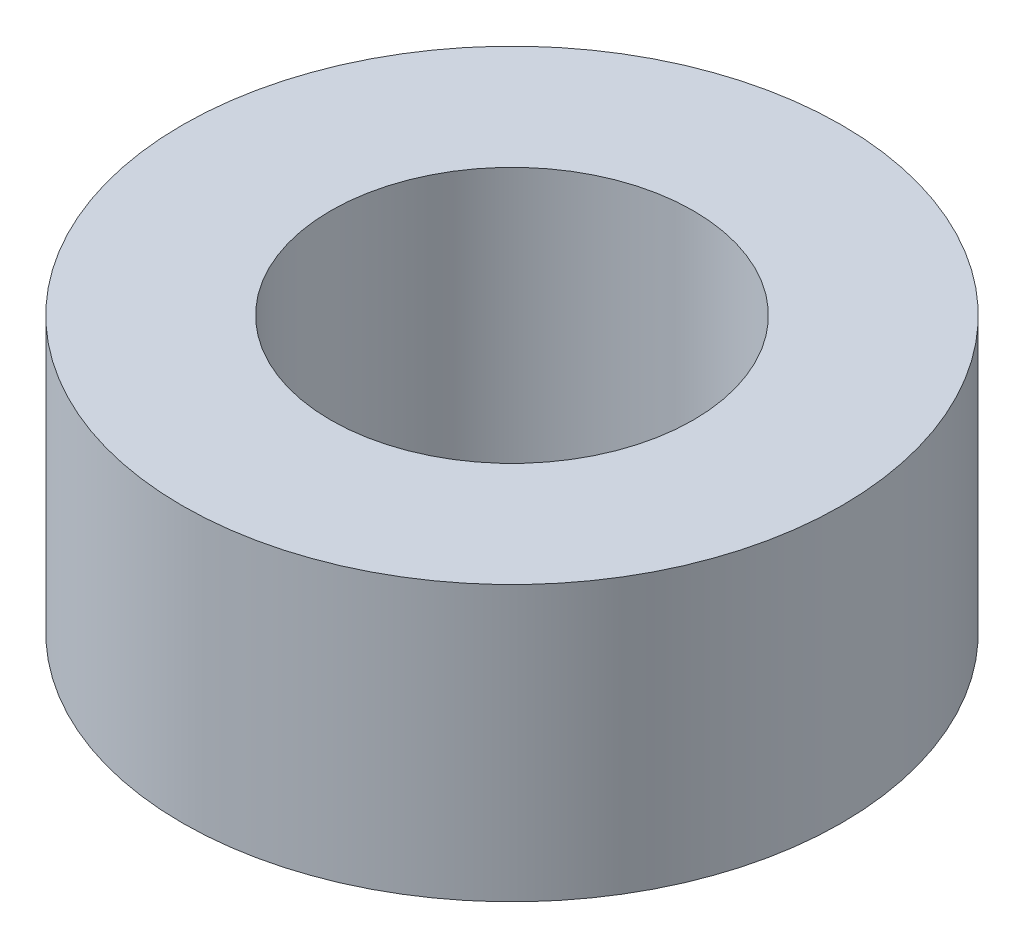
ISO-10303-21;
HEADER;
FILE_DESCRIPTION(('STEP AP214'),'2;1');
FILE_NAME('part.step','',(''),(''),'','','');
FILE_SCHEMA(('AUTOMOTIVE_DESIGN { 1 0 10303 214 1 1 1 1 }'));
ENDSEC;
DATA;
#1=APPLICATION_CONTEXT('core data for automotive mechanical design processes');
#2=APPLICATION_PROTOCOL_DEFINITION('international standard','automotive_design',2000,#1);
#3=PRODUCT_CONTEXT('',#1,'mechanical');
#4=PRODUCT('Part','Part','',(#3));
#5=PRODUCT_RELATED_PRODUCT_CATEGORY('part','',(#4));
#6=PRODUCT_DEFINITION_FORMATION('','',#4);
#7=PRODUCT_DEFINITION_CONTEXT('part definition',#1,'design');
#8=PRODUCT_DEFINITION('design','',#6,#7);
#9=PRODUCT_DEFINITION_SHAPE('','',#8);
#10=(LENGTH_UNIT() NAMED_UNIT(*) SI_UNIT(.MILLI.,.METRE.));
#11=(NAMED_UNIT(*) PLANE_ANGLE_UNIT() SI_UNIT($,.RADIAN.));
#12=(NAMED_UNIT(*) SI_UNIT($,.STERADIAN.) SOLID_ANGLE_UNIT());
#13=UNCERTAINTY_MEASURE_WITH_UNIT(LENGTH_MEASURE(1.E-05),#10,'distance_accuracy_value','');
#14=(GEOMETRIC_REPRESENTATION_CONTEXT(3) GLOBAL_UNCERTAINTY_ASSIGNED_CONTEXT((#13)) GLOBAL_UNIT_ASSIGNED_CONTEXT((#10,
#11,#12)) REPRESENTATION_CONTEXT('',''));
#15=CARTESIAN_POINT('',(0.,0.,0.));
#16=DIRECTION('',(0.,0.,1.));
#17=DIRECTION('',(1.,0.,0.));
#18=AXIS2_PLACEMENT_3D('',#15,#16,#17);
#19=CARTESIAN_POINT('',(0.,2.5,0.));
#20=DIRECTION('',(0.,1.,0.));
#21=DIRECTION('',(0.,0.,1.));
#22=AXIS2_PLACEMENT_3D('',#19,#20,#21);
#23=PLANE('',#22);
#24=CARTESIAN_POINT('',(0.,2.5,0.));
#25=DIRECTION('',(0.,1.,0.));
#26=DIRECTION('',(0.,0.,1.));
#27=AXIS2_PLACEMENT_3D('',#24,#25,#26);
#28=CIRCLE('',#27,3.);
#29=CARTESIAN_POINT('',(0.,2.5,3.));
#30=VERTEX_POINT('',#29);
#31=EDGE_CURVE('E10',#30,#30,#28,.T.);
#32=ORIENTED_EDGE('',*,*,#31,.T.);
#33=EDGE_LOOP('',(#32));
#34=FACE_BOUND('',#33,.T.);
#35=CARTESIAN_POINT('',(0.,2.5,0.));
#36=DIRECTION('',(0.,1.,0.));
#37=DIRECTION('',(0.,0.,1.));
#38=AXIS2_PLACEMENT_3D('',#35,#36,#37);
#39=CIRCLE('',#38,1.65);
#40=CARTESIAN_POINT('',(0.,2.5,1.65));
#41=VERTEX_POINT('',#40);
#42=EDGE_CURVE('E44',#41,#41,#39,.T.);
#43=ORIENTED_EDGE('',*,*,#42,.F.);
#44=EDGE_LOOP('',(#43));
#45=FACE_BOUND('',#44,.T.);
#46=ADVANCED_FACE('F33',(#34,#45),#23,.T.);
#47=CARTESIAN_POINT('',(0.,0.,0.));
#48=DIRECTION('',(0.,1.,0.));
#49=DIRECTION('',(0.,0.,1.));
#50=AXIS2_PLACEMENT_3D('',#47,#48,#49);
#51=PLANE('',#50);
#52=CARTESIAN_POINT('',(0.,0.,0.));
#53=DIRECTION('',(0.,1.,0.));
#54=DIRECTION('',(0.,0.,1.));
#55=AXIS2_PLACEMENT_3D('',#52,#53,#54);
#56=CIRCLE('',#55,3.);
#57=CARTESIAN_POINT('',(0.,0.,3.));
#58=VERTEX_POINT('',#57);
#59=EDGE_CURVE('E37',#58,#58,#56,.T.);
#60=ORIENTED_EDGE('',*,*,#59,.F.);
#61=EDGE_LOOP('',(#60));
#62=FACE_BOUND('',#61,.T.);
#63=CARTESIAN_POINT('',(0.,0.,0.));
#64=DIRECTION('',(0.,1.,0.));
#65=DIRECTION('',(0.,0.,1.));
#66=AXIS2_PLACEMENT_3D('',#63,#64,#65);
#67=CIRCLE('',#66,1.65);
#68=CARTESIAN_POINT('',(0.,0.,1.65));
#69=VERTEX_POINT('',#68);
#70=EDGE_CURVE('E46',#69,#69,#67,.T.);
#71=ORIENTED_EDGE('',*,*,#70,.T.);
#72=EDGE_LOOP('',(#71));
#73=FACE_BOUND('',#72,.T.);
#74=ADVANCED_FACE('F56',(#62,#73),#51,.F.);
#75=CARTESIAN_POINT('',(0.,2.5,0.));
#76=DIRECTION('',(0.,-1.,0.));
#77=DIRECTION('',(0.,0.,-1.));
#78=AXIS2_PLACEMENT_3D('',#75,#76,#77);
#79=CYLINDRICAL_SURFACE('',#78,3.);
#80=ORIENTED_EDGE('',*,*,#31,.F.);
#81=EDGE_LOOP('',(#80));
#82=FACE_BOUND('',#81,.T.);
#83=ORIENTED_EDGE('',*,*,#59,.T.);
#84=EDGE_LOOP('',(#83));
#85=FACE_BOUND('',#84,.T.);
#86=ADVANCED_FACE('F35',(#82,#85),#79,.T.);
#87=CARTESIAN_POINT('',(0.,2.5,0.));
#88=DIRECTION('',(0.,-1.,0.));
#89=DIRECTION('',(0.,0.,-1.));
#90=AXIS2_PLACEMENT_3D('',#87,#88,#89);
#91=CYLINDRICAL_SURFACE('',#90,1.65);
#92=ORIENTED_EDGE('',*,*,#42,.T.);
#93=EDGE_LOOP('',(#92));
#94=FACE_BOUND('',#93,.T.);
#95=ORIENTED_EDGE('',*,*,#70,.F.);
#96=EDGE_LOOP('',(#95));
#97=FACE_BOUND('',#96,.T.);
#98=ADVANCED_FACE('F52',(#94,#97),#91,.F.);
#99=CLOSED_SHELL('',(#46,#74,#86,#98));
#100=MANIFOLD_SOLID_BREP('B2',#99);
#101=ADVANCED_BREP_SHAPE_REPRESENTATION('',(#18,#100),#14);
#102=SHAPE_DEFINITION_REPRESENTATION(#9,#101);
ENDSEC;
END-ISO-10303-21;
